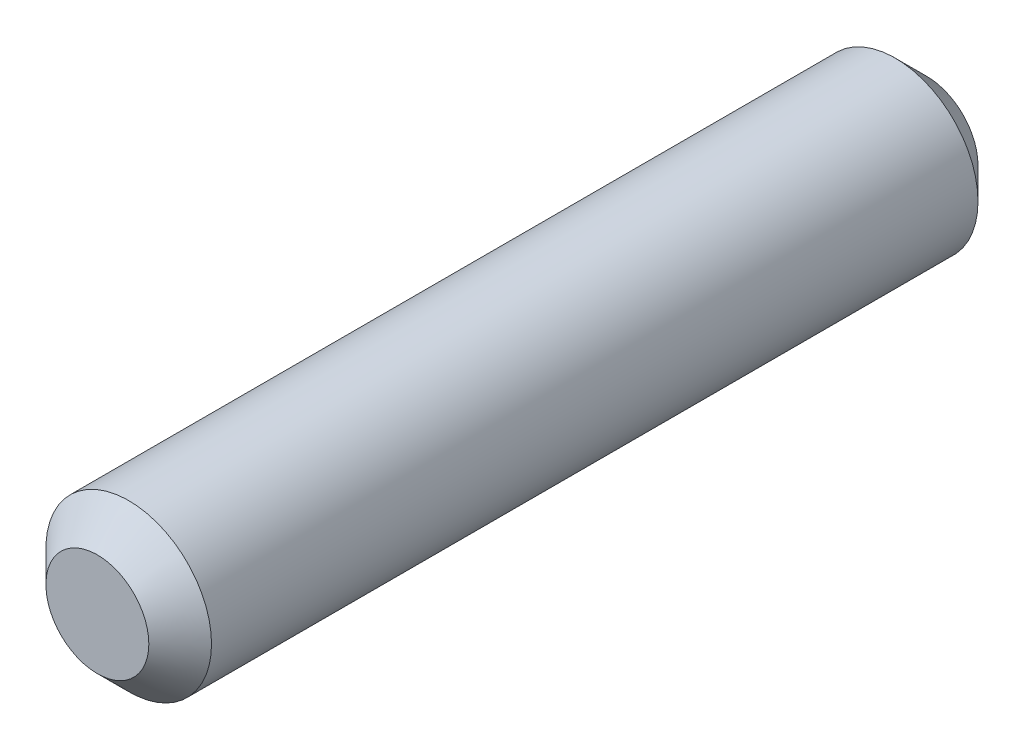
ISO-10303-21;
HEADER;
FILE_DESCRIPTION(('STEP AP214'),'2;1');
FILE_NAME('part.step','',(''),(''),'','','');
FILE_SCHEMA(('AUTOMOTIVE_DESIGN { 1 0 10303 214 1 1 1 1 }'));
ENDSEC;
DATA;
#1=APPLICATION_CONTEXT('core data for automotive mechanical design processes');
#2=APPLICATION_PROTOCOL_DEFINITION('international standard','automotive_design',2000,#1);
#3=PRODUCT_CONTEXT('',#1,'mechanical');
#4=PRODUCT('Part','Part','',(#3));
#5=PRODUCT_RELATED_PRODUCT_CATEGORY('part','',(#4));
#6=PRODUCT_DEFINITION_FORMATION('','',#4);
#7=PRODUCT_DEFINITION_CONTEXT('part definition',#1,'design');
#8=PRODUCT_DEFINITION('design','',#6,#7);
#9=PRODUCT_DEFINITION_SHAPE('','',#8);
#10=(LENGTH_UNIT() NAMED_UNIT(*) SI_UNIT(.MILLI.,.METRE.));
#11=(NAMED_UNIT(*) PLANE_ANGLE_UNIT() SI_UNIT($,.RADIAN.));
#12=(NAMED_UNIT(*) SI_UNIT($,.STERADIAN.) SOLID_ANGLE_UNIT());
#13=UNCERTAINTY_MEASURE_WITH_UNIT(LENGTH_MEASURE(1.E-05),#10,'distance_accuracy_value','');
#14=(GEOMETRIC_REPRESENTATION_CONTEXT(3) GLOBAL_UNCERTAINTY_ASSIGNED_CONTEXT((#13)) GLOBAL_UNIT_ASSIGNED_CONTEXT((#10,
#11,#12)) REPRESENTATION_CONTEXT('',''));
#15=CARTESIAN_POINT('',(0.,0.,0.));
#16=DIRECTION('',(0.,0.,1.));
#17=DIRECTION('',(1.,0.,0.));
#18=AXIS2_PLACEMENT_3D('',#15,#16,#17);
#19=CARTESIAN_POINT('',(0.,0.,15.87));
#20=DIRECTION('',(0.,0.,-1.));
#21=DIRECTION('',(-1.,0.,0.));
#22=AXIS2_PLACEMENT_3D('',#19,#20,#21);
#23=CYLINDRICAL_SURFACE('',#22,1.585);
#24=CARTESIAN_POINT('',(0.,0.,0.599999999999998));
#25=DIRECTION('',(0.,0.,1.));
#26=DIRECTION('',(1.,0.,0.));
#27=AXIS2_PLACEMENT_3D('',#24,#25,#26);
#28=CIRCLE('',#27,1.585);
#29=CARTESIAN_POINT('',(1.585,0.,0.599999999999998));
#30=VERTEX_POINT('',#29);
#31=EDGE_CURVE('E49',#30,#30,#28,.T.);
#32=ORIENTED_EDGE('',*,*,#31,.T.);
#33=EDGE_LOOP('',(#32));
#34=FACE_BOUND('',#33,.T.);
#35=CARTESIAN_POINT('',(0.,0.,15.27));
#36=DIRECTION('',(0.,0.,1.));
#37=DIRECTION('',(1.,0.,0.));
#38=AXIS2_PLACEMENT_3D('',#35,#36,#37);
#39=CIRCLE('',#38,1.585);
#40=CARTESIAN_POINT('',(1.585,0.,15.27));
#41=VERTEX_POINT('',#40);
#42=EDGE_CURVE('E53',#41,#41,#39,.F.);
#43=ORIENTED_EDGE('',*,*,#42,.T.);
#44=EDGE_LOOP('',(#43));
#45=FACE_BOUND('',#44,.T.);
#46=ADVANCED_FACE('F37',(#34,#45),#23,.T.);
#47=CARTESIAN_POINT('',(0.,0.,15.87));
#48=DIRECTION('',(0.,0.,1.));
#49=DIRECTION('',(1.,0.,0.));
#50=AXIS2_PLACEMENT_3D('',#47,#48,#49);
#51=PLANE('',#50);
#52=CARTESIAN_POINT('',(0.,0.,15.87));
#53=DIRECTION('',(0.,0.,1.));
#54=DIRECTION('',(1.,0.,0.));
#55=AXIS2_PLACEMENT_3D('',#52,#53,#54);
#56=CIRCLE('',#55,0.984999999999998);
#57=CARTESIAN_POINT('',(0.984999999999998,0.,15.87));
#58=VERTEX_POINT('',#57);
#59=EDGE_CURVE('E10',#58,#58,#56,.T.);
#60=ORIENTED_EDGE('',*,*,#59,.T.);
#61=EDGE_LOOP('',(#60));
#62=FACE_BOUND('',#61,.T.);
#63=ADVANCED_FACE('F69',(#62),#51,.T.);
#64=CARTESIAN_POINT('',(0.,0.,0.));
#65=DIRECTION('',(0.,0.,1.));
#66=DIRECTION('',(1.,0.,0.));
#67=AXIS2_PLACEMENT_3D('',#64,#65,#66);
#68=PLANE('',#67);
#69=CARTESIAN_POINT('',(0.,0.,0.));
#70=DIRECTION('',(0.,0.,1.));
#71=DIRECTION('',(1.,0.,0.));
#72=AXIS2_PLACEMENT_3D('',#69,#70,#71);
#73=CIRCLE('',#72,0.984999999999998);
#74=CARTESIAN_POINT('',(0.984999999999998,0.,0.));
#75=VERTEX_POINT('',#74);
#76=EDGE_CURVE('E45',#75,#75,#73,.F.);
#77=ORIENTED_EDGE('',*,*,#76,.T.);
#78=EDGE_LOOP('',(#77));
#79=FACE_BOUND('',#78,.T.);
#80=ADVANCED_FACE('F66',(#79),#68,.F.);
#81=CARTESIAN_POINT('',(0.,0.,0.599999999999998));
#82=DIRECTION('',(0.,0.,1.));
#83=DIRECTION('',(1.,0.,0.));
#84=AXIS2_PLACEMENT_3D('',#81,#82,#83);
#85=CONICAL_SURFACE('',#84,1.585,0.785398163397451);
#86=ORIENTED_EDGE('',*,*,#76,.F.);
#87=EDGE_LOOP('',(#86));
#88=FACE_BOUND('',#87,.T.);
#89=ORIENTED_EDGE('',*,*,#31,.F.);
#90=EDGE_LOOP('',(#89));
#91=FACE_BOUND('',#90,.T.);
#92=ADVANCED_FACE('F62',(#88,#91),#85,.T.);
#93=CARTESIAN_POINT('',(0.,0.,15.87));
#94=DIRECTION('',(0.,0.,-1.));
#95=DIRECTION('',(-1.,0.,0.));
#96=AXIS2_PLACEMENT_3D('',#93,#94,#95);
#97=CONICAL_SURFACE('',#96,0.984999999999998,0.785398163397447);
#98=ORIENTED_EDGE('',*,*,#42,.F.);
#99=EDGE_LOOP('',(#98));
#100=FACE_BOUND('',#99,.T.);
#101=ORIENTED_EDGE('',*,*,#59,.F.);
#102=EDGE_LOOP('',(#101));
#103=FACE_BOUND('',#102,.T.);
#104=ADVANCED_FACE('F40',(#100,#103),#97,.T.);
#105=CLOSED_SHELL('',(#46,#63,#80,#92,#104));
#106=MANIFOLD_SOLID_BREP('B2',#105);
#107=ADVANCED_BREP_SHAPE_REPRESENTATION('',(#18,#106),#14);
#108=SHAPE_DEFINITION_REPRESENTATION(#9,#107);
ENDSEC;
END-ISO-10303-21;
